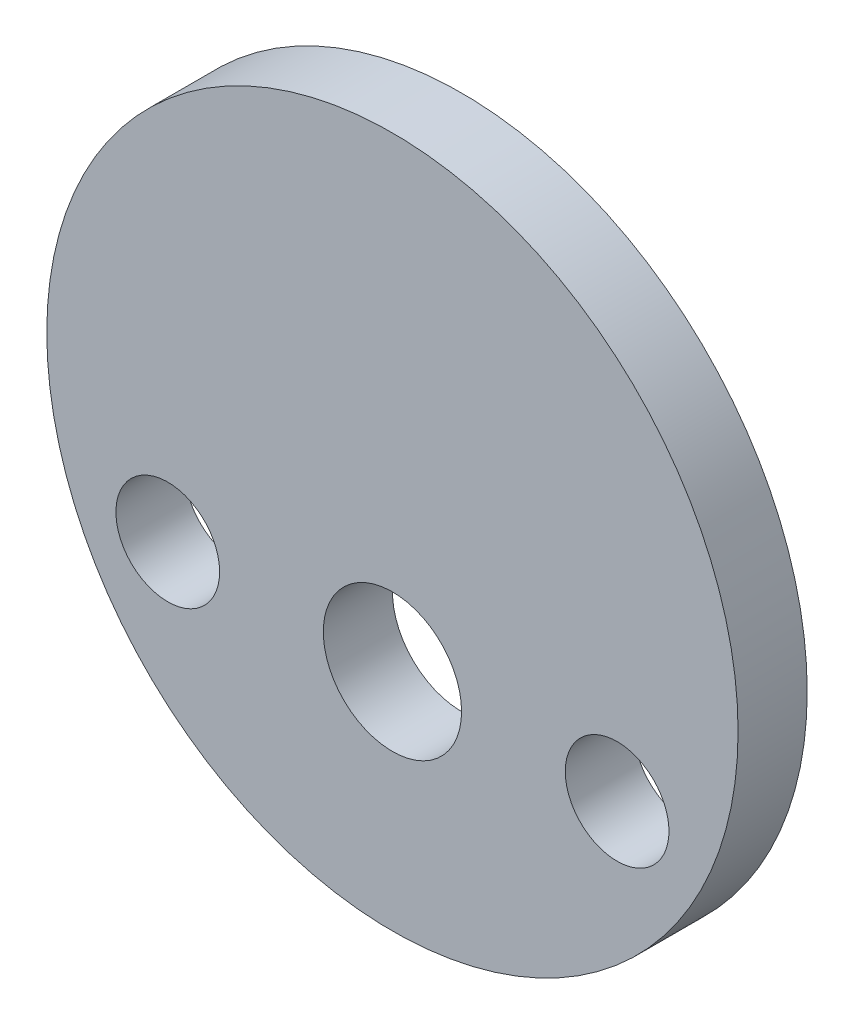
ISO-10303-21;
HEADER;
FILE_DESCRIPTION(('STEP AP214'),'2;1');
FILE_NAME('part.step','',(''),(''),'','','');
FILE_SCHEMA(('AUTOMOTIVE_DESIGN { 1 0 10303 214 1 1 1 1 }'));
ENDSEC;
DATA;
#1=APPLICATION_CONTEXT('core data for automotive mechanical design processes');
#2=APPLICATION_PROTOCOL_DEFINITION('international standard','automotive_design',2000,#1);
#3=PRODUCT_CONTEXT('',#1,'mechanical');
#4=PRODUCT('Part','Part','',(#3));
#5=PRODUCT_RELATED_PRODUCT_CATEGORY('part','',(#4));
#6=PRODUCT_DEFINITION_FORMATION('','',#4);
#7=PRODUCT_DEFINITION_CONTEXT('part definition',#1,'design');
#8=PRODUCT_DEFINITION('design','',#6,#7);
#9=PRODUCT_DEFINITION_SHAPE('','',#8);
#10=(LENGTH_UNIT() NAMED_UNIT(*) SI_UNIT(.MILLI.,.METRE.));
#11=(NAMED_UNIT(*) PLANE_ANGLE_UNIT() SI_UNIT($,.RADIAN.));
#12=(NAMED_UNIT(*) SI_UNIT($,.STERADIAN.) SOLID_ANGLE_UNIT());
#13=UNCERTAINTY_MEASURE_WITH_UNIT(LENGTH_MEASURE(1.E-05),#10,'distance_accuracy_value','');
#14=(GEOMETRIC_REPRESENTATION_CONTEXT(3) GLOBAL_UNCERTAINTY_ASSIGNED_CONTEXT((#13)) GLOBAL_UNIT_ASSIGNED_CONTEXT((#10,
#11,#12)) REPRESENTATION_CONTEXT('',''));
#15=CARTESIAN_POINT('',(0.,0.,0.));
#16=DIRECTION('',(0.,0.,1.));
#17=DIRECTION('',(1.,0.,0.));
#18=AXIS2_PLACEMENT_3D('',#15,#16,#17);
#19=CARTESIAN_POINT('',(-0.589945762939997,5.34282561400124,2.));
#20=DIRECTION('',(0.,0.,1.));
#21=DIRECTION('',(1.,0.,0.));
#22=AXIS2_PLACEMENT_3D('',#19,#20,#21);
#23=PLANE('',#22);
#24=CARTESIAN_POINT('',(5.91005423706,1.84282561400124,2.));
#25=DIRECTION('',(0.,0.,1.));
#26=DIRECTION('',(-1.,0.,0.));
#27=AXIS2_PLACEMENT_3D('',#24,#25,#26);
#28=CIRCLE('',#27,1.5);
#29=CARTESIAN_POINT('',(4.41005423706,1.84282561400124,2.));
#30=VERTEX_POINT('',#29);
#31=EDGE_CURVE('E56',#30,#30,#28,.T.);
#32=ORIENTED_EDGE('',*,*,#31,.F.);
#33=EDGE_LOOP('',(#32));
#34=FACE_BOUND('',#33,.T.);
#35=CARTESIAN_POINT('',(-0.589945762939997,5.34282561400124,2.));
#36=DIRECTION('',(0.,0.,1.));
#37=DIRECTION('',(1.,0.,0.));
#38=AXIS2_PLACEMENT_3D('',#35,#36,#37);
#39=CIRCLE('',#38,10.);
#40=CARTESIAN_POINT('',(9.41005423706,5.34282561400124,2.));
#41=VERTEX_POINT('',#40);
#42=EDGE_CURVE('E10',#41,#41,#39,.T.);
#43=ORIENTED_EDGE('',*,*,#42,.T.);
#44=EDGE_LOOP('',(#43));
#45=FACE_BOUND('',#44,.T.);
#46=CARTESIAN_POINT('',(-7.08994576294,1.84282561400124,2.));
#47=DIRECTION('',(0.,0.,1.));
#48=DIRECTION('',(1.,0.,0.));
#49=AXIS2_PLACEMENT_3D('',#46,#47,#48);
#50=CIRCLE('',#49,1.5);
#51=CARTESIAN_POINT('',(-5.58994576294,1.84282561400124,2.));
#52=VERTEX_POINT('',#51);
#53=EDGE_CURVE('E50',#52,#52,#50,.T.);
#54=ORIENTED_EDGE('',*,*,#53,.F.);
#55=EDGE_LOOP('',(#54));
#56=FACE_BOUND('',#55,.T.);
#57=CARTESIAN_POINT('',(-0.589945762939997,1.84282561400124,2.));
#58=DIRECTION('',(0.,0.,1.));
#59=DIRECTION('',(1.,0.,0.));
#60=AXIS2_PLACEMENT_3D('',#57,#58,#59);
#61=CIRCLE('',#60,2.);
#62=CARTESIAN_POINT('',(1.41005423706,1.84282561400124,2.));
#63=VERTEX_POINT('',#62);
#64=EDGE_CURVE('E64',#63,#63,#61,.T.);
#65=ORIENTED_EDGE('',*,*,#64,.F.);
#66=EDGE_LOOP('',(#65));
#67=FACE_BOUND('',#66,.T.);
#68=ADVANCED_FACE('F37',(#34,#45,#56,#67),#23,.T.);
#69=CARTESIAN_POINT('',(-0.589945762939997,5.34282561400124,0.));
#70=DIRECTION('',(0.,0.,1.));
#71=DIRECTION('',(1.,0.,0.));
#72=AXIS2_PLACEMENT_3D('',#69,#70,#71);
#73=PLANE('',#72);
#74=CARTESIAN_POINT('',(-0.589945762939997,5.34282561400124,0.));
#75=DIRECTION('',(0.,0.,1.));
#76=DIRECTION('',(1.,0.,0.));
#77=AXIS2_PLACEMENT_3D('',#74,#75,#76);
#78=CIRCLE('',#77,10.);
#79=CARTESIAN_POINT('',(9.41005423706,5.34282561400124,0.));
#80=VERTEX_POINT('',#79);
#81=EDGE_CURVE('E41',#80,#80,#78,.T.);
#82=ORIENTED_EDGE('',*,*,#81,.F.);
#83=EDGE_LOOP('',(#82));
#84=FACE_BOUND('',#83,.T.);
#85=CARTESIAN_POINT('',(-7.08994576294,1.84282561400124,0.));
#86=DIRECTION('',(0.,0.,1.));
#87=DIRECTION('',(1.,0.,0.));
#88=AXIS2_PLACEMENT_3D('',#85,#86,#87);
#89=CIRCLE('',#88,1.5);
#90=CARTESIAN_POINT('',(-5.58994576294,1.84282561400124,0.));
#91=VERTEX_POINT('',#90);
#92=EDGE_CURVE('E52',#91,#91,#89,.T.);
#93=ORIENTED_EDGE('',*,*,#92,.T.);
#94=EDGE_LOOP('',(#93));
#95=FACE_BOUND('',#94,.T.);
#96=CARTESIAN_POINT('',(5.91005423706,1.84282561400124,0.));
#97=DIRECTION('',(0.,0.,1.));
#98=DIRECTION('',(-1.,0.,0.));
#99=AXIS2_PLACEMENT_3D('',#96,#97,#98);
#100=CIRCLE('',#99,1.5);
#101=CARTESIAN_POINT('',(4.41005423706,1.84282561400124,0.));
#102=VERTEX_POINT('',#101);
#103=EDGE_CURVE('E60',#102,#102,#100,.T.);
#104=ORIENTED_EDGE('',*,*,#103,.T.);
#105=EDGE_LOOP('',(#104));
#106=FACE_BOUND('',#105,.T.);
#107=CARTESIAN_POINT('',(-0.589945762939997,1.84282561400124,0.));
#108=DIRECTION('',(0.,0.,1.));
#109=DIRECTION('',(1.,0.,0.));
#110=AXIS2_PLACEMENT_3D('',#107,#108,#109);
#111=CIRCLE('',#110,2.);
#112=CARTESIAN_POINT('',(1.41005423706,1.84282561400124,0.));
#113=VERTEX_POINT('',#112);
#114=EDGE_CURVE('E68',#113,#113,#111,.T.);
#115=ORIENTED_EDGE('',*,*,#114,.T.);
#116=EDGE_LOOP('',(#115));
#117=FACE_BOUND('',#116,.T.);
#118=ADVANCED_FACE('F80',(#84,#95,#106,#117),#73,.F.);
#119=CARTESIAN_POINT('',(-0.589945762939997,5.34282561400124,2.));
#120=DIRECTION('',(0.,0.,-1.));
#121=DIRECTION('',(-1.,0.,0.));
#122=AXIS2_PLACEMENT_3D('',#119,#120,#121);
#123=CYLINDRICAL_SURFACE('',#122,10.);
#124=ORIENTED_EDGE('',*,*,#42,.F.);
#125=EDGE_LOOP('',(#124));
#126=FACE_BOUND('',#125,.T.);
#127=ORIENTED_EDGE('',*,*,#81,.T.);
#128=EDGE_LOOP('',(#127));
#129=FACE_BOUND('',#128,.T.);
#130=ADVANCED_FACE('F39',(#126,#129),#123,.T.);
#131=CARTESIAN_POINT('',(-7.08994576294,1.84282561400124,2.));
#132=DIRECTION('',(0.,0.,-1.));
#133=DIRECTION('',(-1.,0.,0.));
#134=AXIS2_PLACEMENT_3D('',#131,#132,#133);
#135=CYLINDRICAL_SURFACE('',#134,1.5);
#136=ORIENTED_EDGE('',*,*,#53,.T.);
#137=EDGE_LOOP('',(#136));
#138=FACE_BOUND('',#137,.T.);
#139=ORIENTED_EDGE('',*,*,#92,.F.);
#140=EDGE_LOOP('',(#139));
#141=FACE_BOUND('',#140,.T.);
#142=ADVANCED_FACE('F89',(#138,#141),#135,.F.);
#143=CARTESIAN_POINT('',(5.91005423706,1.84282561400124,2.));
#144=DIRECTION('',(0.,0.,-1.));
#145=DIRECTION('',(-1.,0.,0.));
#146=AXIS2_PLACEMENT_3D('',#143,#144,#145);
#147=CYLINDRICAL_SURFACE('',#146,1.5);
#148=ORIENTED_EDGE('',*,*,#31,.T.);
#149=EDGE_LOOP('',(#148));
#150=FACE_BOUND('',#149,.T.);
#151=ORIENTED_EDGE('',*,*,#103,.F.);
#152=EDGE_LOOP('',(#151));
#153=FACE_BOUND('',#152,.T.);
#154=ADVANCED_FACE('F92',(#150,#153),#147,.F.);
#155=CARTESIAN_POINT('',(-0.589945762939997,1.84282561400124,2.));
#156=DIRECTION('',(0.,0.,-1.));
#157=DIRECTION('',(-1.,0.,0.));
#158=AXIS2_PLACEMENT_3D('',#155,#156,#157);
#159=CYLINDRICAL_SURFACE('',#158,2.);
#160=ORIENTED_EDGE('',*,*,#64,.T.);
#161=EDGE_LOOP('',(#160));
#162=FACE_BOUND('',#161,.T.);
#163=ORIENTED_EDGE('',*,*,#114,.F.);
#164=EDGE_LOOP('',(#163));
#165=FACE_BOUND('',#164,.T.);
#166=ADVANCED_FACE('F76',(#162,#165),#159,.F.);
#167=CLOSED_SHELL('',(#68,#118,#130,#142,#154,#166));
#168=MANIFOLD_SOLID_BREP('B2',#167);
#169=ADVANCED_BREP_SHAPE_REPRESENTATION('',(#18,#168),#14);
#170=SHAPE_DEFINITION_REPRESENTATION(#9,#169);
ENDSEC;
END-ISO-10303-21;
